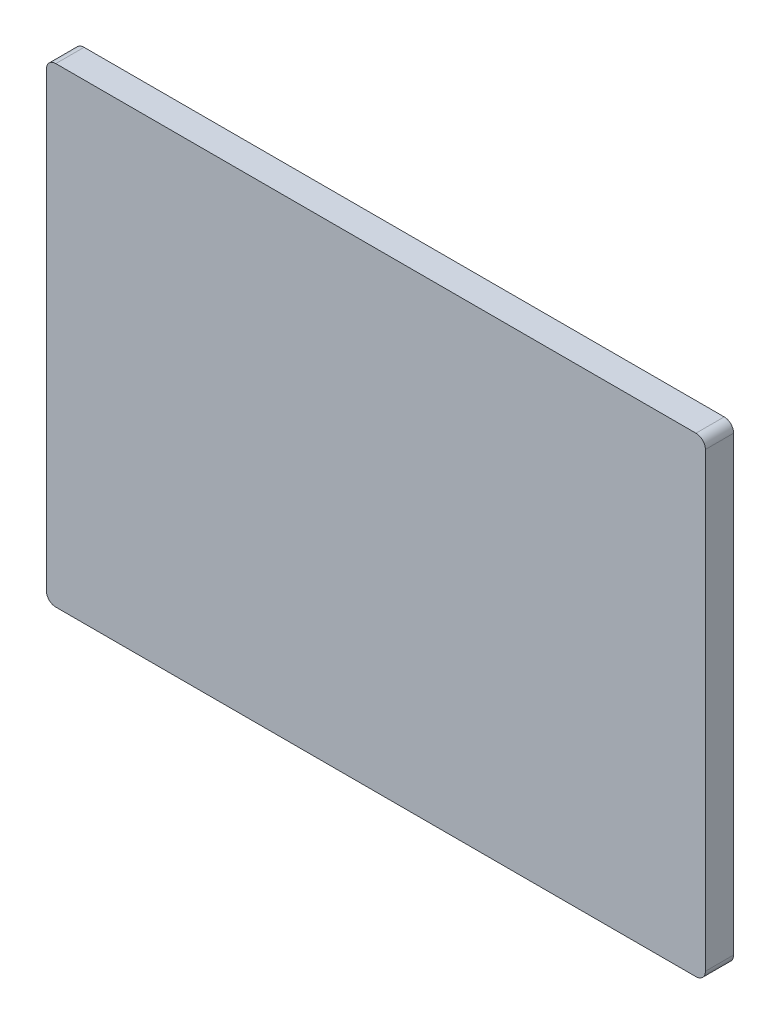
ISO-10303-21;
HEADER;
FILE_DESCRIPTION(('STEP AP214'),'2;1');
FILE_NAME('part.step','',(''),(''),'','','');
FILE_SCHEMA(('AUTOMOTIVE_DESIGN { 1 0 10303 214 1 1 1 1 }'));
ENDSEC;
DATA;
#1=APPLICATION_CONTEXT('core data for automotive mechanical design processes');
#2=APPLICATION_PROTOCOL_DEFINITION('international standard','automotive_design',2000,#1);
#3=PRODUCT_CONTEXT('',#1,'mechanical');
#4=PRODUCT('Part','Part','',(#3));
#5=PRODUCT_RELATED_PRODUCT_CATEGORY('part','',(#4));
#6=PRODUCT_DEFINITION_FORMATION('','',#4);
#7=PRODUCT_DEFINITION_CONTEXT('part definition',#1,'design');
#8=PRODUCT_DEFINITION('design','',#6,#7);
#9=PRODUCT_DEFINITION_SHAPE('','',#8);
#10=(LENGTH_UNIT() NAMED_UNIT(*) SI_UNIT(.MILLI.,.METRE.));
#11=(NAMED_UNIT(*) PLANE_ANGLE_UNIT() SI_UNIT($,.RADIAN.));
#12=(NAMED_UNIT(*) SI_UNIT($,.STERADIAN.) SOLID_ANGLE_UNIT());
#13=UNCERTAINTY_MEASURE_WITH_UNIT(LENGTH_MEASURE(1.E-05),#10,'distance_accuracy_value','');
#14=(GEOMETRIC_REPRESENTATION_CONTEXT(3) GLOBAL_UNCERTAINTY_ASSIGNED_CONTEXT((#13)) GLOBAL_UNIT_ASSIGNED_CONTEXT((#10,
#11,#12)) REPRESENTATION_CONTEXT('',''));
#15=CARTESIAN_POINT('',(0.,0.,0.));
#16=DIRECTION('',(0.,0.,1.));
#17=DIRECTION('',(1.,0.,0.));
#18=AXIS2_PLACEMENT_3D('',#15,#16,#17);
#19=CARTESIAN_POINT('',(-175.,-125.,15.));
#20=DIRECTION('',(1.,0.,0.));
#21=DIRECTION('',(0.,0.,-1.));
#22=AXIS2_PLACEMENT_3D('',#19,#20,#21);
#23=PLANE('',#22);
#24=DIRECTION('',(0.,-1.,0.));
#25=VECTOR('',#24,1.);
#26=CARTESIAN_POINT('',(-175.,-125.,0.));
#27=LINE('',#26,#25);
#28=CARTESIAN_POINT('',(-175.,120.,0.));
#29=VERTEX_POINT('',#28);
#30=CARTESIAN_POINT('',(-175.,-120.,0.));
#31=VERTEX_POINT('',#30);
#32=EDGE_CURVE('E127',#29,#31,#27,.T.);
#33=ORIENTED_EDGE('',*,*,#32,.T.);
#34=DIRECTION('',(0.,0.,-1.));
#35=VECTOR('',#34,1.);
#36=CARTESIAN_POINT('',(-175.,-120.,15.));
#37=LINE('',#36,#35);
#38=CARTESIAN_POINT('',(-175.,-120.,15.));
#39=VERTEX_POINT('',#38);
#40=EDGE_CURVE('E150',#31,#39,#37,.F.);
#41=ORIENTED_EDGE('',*,*,#40,.T.);
#42=DIRECTION('',(0.,-1.,0.));
#43=VECTOR('',#42,1.);
#44=CARTESIAN_POINT('',(-175.,-125.,15.));
#45=LINE('',#44,#43);
#46=CARTESIAN_POINT('',(-175.,120.,15.));
#47=VERTEX_POINT('',#46);
#48=EDGE_CURVE('E125',#47,#39,#45,.T.);
#49=ORIENTED_EDGE('',*,*,#48,.F.);
#50=DIRECTION('',(0.,0.,-1.));
#51=VECTOR('',#50,1.);
#52=CARTESIAN_POINT('',(-175.,120.,15.));
#53=LINE('',#52,#51);
#54=EDGE_CURVE('E147',#47,#29,#53,.T.);
#55=ORIENTED_EDGE('',*,*,#54,.T.);
#56=EDGE_LOOP('',(#33,#41,#49,#55));
#57=FACE_BOUND('',#56,.T.);
#58=ADVANCED_FACE('F32',(#57),#23,.F.);
#59=CARTESIAN_POINT('',(175.,-125.,15.));
#60=DIRECTION('',(0.,1.,0.));
#61=DIRECTION('',(-1.,0.,0.));
#62=AXIS2_PLACEMENT_3D('',#59,#60,#61);
#63=PLANE('',#62);
#64=DIRECTION('',(1.,0.,0.));
#65=VECTOR('',#64,1.);
#66=CARTESIAN_POINT('',(175.,-125.,0.));
#67=LINE('',#66,#65);
#68=CARTESIAN_POINT('',(-170.,-125.,0.));
#69=VERTEX_POINT('',#68);
#70=CARTESIAN_POINT('',(170.,-125.,0.));
#71=VERTEX_POINT('',#70);
#72=EDGE_CURVE('E123',#69,#71,#67,.T.);
#73=ORIENTED_EDGE('',*,*,#72,.T.);
#74=DIRECTION('',(0.,0.,-1.));
#75=VECTOR('',#74,1.);
#76=CARTESIAN_POINT('',(170.,-125.,15.));
#77=LINE('',#76,#75);
#78=CARTESIAN_POINT('',(170.,-125.,15.));
#79=VERTEX_POINT('',#78);
#80=EDGE_CURVE('E102',#71,#79,#77,.F.);
#81=ORIENTED_EDGE('',*,*,#80,.T.);
#82=DIRECTION('',(1.,0.,0.));
#83=VECTOR('',#82,1.);
#84=CARTESIAN_POINT('',(175.,-125.,15.));
#85=LINE('',#84,#83);
#86=CARTESIAN_POINT('',(-170.,-125.,15.));
#87=VERTEX_POINT('',#86);
#88=EDGE_CURVE('E166',#87,#79,#85,.T.);
#89=ORIENTED_EDGE('',*,*,#88,.F.);
#90=DIRECTION('',(0.,0.,-1.));
#91=VECTOR('',#90,1.);
#92=CARTESIAN_POINT('',(-170.,-125.,15.));
#93=LINE('',#92,#91);
#94=EDGE_CURVE('E107',#87,#69,#93,.T.);
#95=ORIENTED_EDGE('',*,*,#94,.T.);
#96=EDGE_LOOP('',(#73,#81,#89,#95));
#97=FACE_BOUND('',#96,.T.);
#98=ADVANCED_FACE('F183',(#97),#63,.F.);
#99=CARTESIAN_POINT('',(175.,-125.,15.));
#100=DIRECTION('',(-1.,0.,0.));
#101=DIRECTION('',(0.,0.,1.));
#102=AXIS2_PLACEMENT_3D('',#99,#100,#101);
#103=PLANE('',#102);
#104=DIRECTION('',(0.,1.,0.));
#105=VECTOR('',#104,1.);
#106=CARTESIAN_POINT('',(175.,-125.,15.));
#107=LINE('',#106,#105);
#108=CARTESIAN_POINT('',(175.,-120.,15.));
#109=VERTEX_POINT('',#108);
#110=CARTESIAN_POINT('',(175.,120.,15.));
#111=VERTEX_POINT('',#110);
#112=EDGE_CURVE('E116',#109,#111,#107,.T.);
#113=ORIENTED_EDGE('',*,*,#112,.F.);
#114=DIRECTION('',(0.,0.,-1.));
#115=VECTOR('',#114,1.);
#116=CARTESIAN_POINT('',(175.,-120.,15.));
#117=LINE('',#116,#115);
#118=CARTESIAN_POINT('',(175.,-120.,0.));
#119=VERTEX_POINT('',#118);
#120=EDGE_CURVE('E101',#109,#119,#117,.T.);
#121=ORIENTED_EDGE('',*,*,#120,.T.);
#122=DIRECTION('',(0.,1.,0.));
#123=VECTOR('',#122,1.);
#124=CARTESIAN_POINT('',(175.,-125.,0.));
#125=LINE('',#124,#123);
#126=CARTESIAN_POINT('',(175.,120.,0.));
#127=VERTEX_POINT('',#126);
#128=EDGE_CURVE('E114',#119,#127,#125,.T.);
#129=ORIENTED_EDGE('',*,*,#128,.T.);
#130=DIRECTION('',(0.,0.,-1.));
#131=VECTOR('',#130,1.);
#132=CARTESIAN_POINT('',(175.,120.,15.));
#133=LINE('',#132,#131);
#134=EDGE_CURVE('E118',#127,#111,#133,.F.);
#135=ORIENTED_EDGE('',*,*,#134,.T.);
#136=EDGE_LOOP('',(#113,#121,#129,#135));
#137=FACE_BOUND('',#136,.T.);
#138=ADVANCED_FACE('F113',(#137),#103,.F.);
#139=CARTESIAN_POINT('',(175.,125.,15.));
#140=DIRECTION('',(0.,-1.,0.));
#141=DIRECTION('',(1.,0.,0.));
#142=AXIS2_PLACEMENT_3D('',#139,#140,#141);
#143=PLANE('',#142);
#144=DIRECTION('',(-1.,0.,0.));
#145=VECTOR('',#144,1.);
#146=CARTESIAN_POINT('',(175.,125.,0.));
#147=LINE('',#146,#145);
#148=CARTESIAN_POINT('',(170.,125.,0.));
#149=VERTEX_POINT('',#148);
#150=CARTESIAN_POINT('',(-170.,125.,0.));
#151=VERTEX_POINT('',#150);
#152=EDGE_CURVE('E122',#149,#151,#147,.T.);
#153=ORIENTED_EDGE('',*,*,#152,.T.);
#154=DIRECTION('',(0.,0.,-1.));
#155=VECTOR('',#154,1.);
#156=CARTESIAN_POINT('',(-170.,125.,15.));
#157=LINE('',#156,#155);
#158=CARTESIAN_POINT('',(-170.,125.,15.));
#159=VERTEX_POINT('',#158);
#160=EDGE_CURVE('E11',#151,#159,#157,.F.);
#161=ORIENTED_EDGE('',*,*,#160,.T.);
#162=DIRECTION('',(-1.,0.,0.));
#163=VECTOR('',#162,1.);
#164=CARTESIAN_POINT('',(175.,125.,15.));
#165=LINE('',#164,#163);
#166=CARTESIAN_POINT('',(170.,125.,15.));
#167=VERTEX_POINT('',#166);
#168=EDGE_CURVE('E131',#167,#159,#165,.T.);
#169=ORIENTED_EDGE('',*,*,#168,.F.);
#170=DIRECTION('',(0.,0.,-1.));
#171=VECTOR('',#170,1.);
#172=CARTESIAN_POINT('',(170.,125.,15.));
#173=LINE('',#172,#171);
#174=EDGE_CURVE('E40',#167,#149,#173,.T.);
#175=ORIENTED_EDGE('',*,*,#174,.T.);
#176=EDGE_LOOP('',(#153,#161,#169,#175));
#177=FACE_BOUND('',#176,.T.);
#178=ADVANCED_FACE('F153',(#177),#143,.F.);
#179=CARTESIAN_POINT('',(0.,0.,15.));
#180=DIRECTION('',(0.,0.,1.));
#181=DIRECTION('',(1.,0.,0.));
#182=AXIS2_PLACEMENT_3D('',#179,#180,#181);
#183=PLANE('',#182);
#184=ORIENTED_EDGE('',*,*,#88,.T.);
#185=CARTESIAN_POINT('',(170.,-120.,15.));
#186=DIRECTION('',(0.,0.,1.));
#187=DIRECTION('',(1.,0.,0.));
#188=AXIS2_PLACEMENT_3D('',#185,#186,#187);
#189=CIRCLE('',#188,5.);
#190=EDGE_CURVE('E145',#79,#109,#189,.T.);
#191=ORIENTED_EDGE('',*,*,#190,.T.);
#192=ORIENTED_EDGE('',*,*,#112,.T.);
#193=CARTESIAN_POINT('',(170.,120.,15.));
#194=DIRECTION('',(0.,0.,1.));
#195=DIRECTION('',(1.,0.,0.));
#196=AXIS2_PLACEMENT_3D('',#193,#194,#195);
#197=CIRCLE('',#196,5.);
#198=EDGE_CURVE('E52',#111,#167,#197,.T.);
#199=ORIENTED_EDGE('',*,*,#198,.T.);
#200=ORIENTED_EDGE('',*,*,#168,.T.);
#201=CARTESIAN_POINT('',(-170.,120.,15.));
#202=DIRECTION('',(0.,0.,1.));
#203=DIRECTION('',(1.,0.,0.));
#204=AXIS2_PLACEMENT_3D('',#201,#202,#203);
#205=CIRCLE('',#204,5.);
#206=EDGE_CURVE('E141',#159,#47,#205,.T.);
#207=ORIENTED_EDGE('',*,*,#206,.T.);
#208=ORIENTED_EDGE('',*,*,#48,.T.);
#209=CARTESIAN_POINT('',(-170.,-120.,15.));
#210=DIRECTION('',(0.,0.,1.));
#211=DIRECTION('',(1.,0.,0.));
#212=AXIS2_PLACEMENT_3D('',#209,#210,#211);
#213=CIRCLE('',#212,5.);
#214=EDGE_CURVE('E143',#39,#87,#213,.T.);
#215=ORIENTED_EDGE('',*,*,#214,.T.);
#216=EDGE_LOOP('',(#184,#191,#192,#199,#200,#207,#208,#215));
#217=FACE_BOUND('',#216,.T.);
#218=ADVANCED_FACE('F172',(#217),#183,.T.);
#219=CARTESIAN_POINT('',(0.,0.,0.));
#220=DIRECTION('',(0.,0.,1.));
#221=DIRECTION('',(1.,0.,0.));
#222=AXIS2_PLACEMENT_3D('',#219,#220,#221);
#223=PLANE('',#222);
#224=ORIENTED_EDGE('',*,*,#128,.F.);
#225=CARTESIAN_POINT('',(170.,-120.,0.));
#226=DIRECTION('',(0.,0.,1.));
#227=DIRECTION('',(1.,0.,0.));
#228=AXIS2_PLACEMENT_3D('',#225,#226,#227);
#229=CIRCLE('',#228,5.);
#230=EDGE_CURVE('E97',#119,#71,#229,.F.);
#231=ORIENTED_EDGE('',*,*,#230,.T.);
#232=ORIENTED_EDGE('',*,*,#72,.F.);
#233=CARTESIAN_POINT('',(-170.,-120.,0.));
#234=DIRECTION('',(0.,0.,1.));
#235=DIRECTION('',(1.,0.,0.));
#236=AXIS2_PLACEMENT_3D('',#233,#234,#235);
#237=CIRCLE('',#236,5.);
#238=EDGE_CURVE('E108',#69,#31,#237,.F.);
#239=ORIENTED_EDGE('',*,*,#238,.T.);
#240=ORIENTED_EDGE('',*,*,#32,.F.);
#241=CARTESIAN_POINT('',(-170.,120.,0.));
#242=DIRECTION('',(0.,0.,1.));
#243=DIRECTION('',(1.,0.,0.));
#244=AXIS2_PLACEMENT_3D('',#241,#242,#243);
#245=CIRCLE('',#244,5.);
#246=EDGE_CURVE('E134',#29,#151,#245,.F.);
#247=ORIENTED_EDGE('',*,*,#246,.T.);
#248=ORIENTED_EDGE('',*,*,#152,.F.);
#249=CARTESIAN_POINT('',(170.,120.,0.));
#250=DIRECTION('',(0.,0.,1.));
#251=DIRECTION('',(1.,0.,0.));
#252=AXIS2_PLACEMENT_3D('',#249,#250,#251);
#253=CIRCLE('',#252,5.);
#254=EDGE_CURVE('E117',#149,#127,#253,.F.);
#255=ORIENTED_EDGE('',*,*,#254,.T.);
#256=EDGE_LOOP('',(#224,#231,#232,#239,#240,#247,#248,#255));
#257=FACE_BOUND('',#256,.T.);
#258=ADVANCED_FACE('F120',(#257),#223,.F.);
#259=CARTESIAN_POINT('',(170.,-120.,15.));
#260=DIRECTION('',(0.,0.,-1.));
#261=DIRECTION('',(-1.,0.,0.));
#262=AXIS2_PLACEMENT_3D('',#259,#260,#261);
#263=CYLINDRICAL_SURFACE('',#262,5.);
#264=ORIENTED_EDGE('',*,*,#190,.F.);
#265=ORIENTED_EDGE('',*,*,#80,.F.);
#266=ORIENTED_EDGE('',*,*,#230,.F.);
#267=ORIENTED_EDGE('',*,*,#120,.F.);
#268=EDGE_LOOP('',(#264,#265,#266,#267));
#269=FACE_BOUND('',#268,.T.);
#270=ADVANCED_FACE('F100',(#269),#263,.T.);
#271=CARTESIAN_POINT('',(-170.,-120.,15.));
#272=DIRECTION('',(0.,0.,-1.));
#273=DIRECTION('',(-1.,0.,0.));
#274=AXIS2_PLACEMENT_3D('',#271,#272,#273);
#275=CYLINDRICAL_SURFACE('',#274,5.);
#276=ORIENTED_EDGE('',*,*,#214,.F.);
#277=ORIENTED_EDGE('',*,*,#40,.F.);
#278=ORIENTED_EDGE('',*,*,#238,.F.);
#279=ORIENTED_EDGE('',*,*,#94,.F.);
#280=EDGE_LOOP('',(#276,#277,#278,#279));
#281=FACE_BOUND('',#280,.T.);
#282=ADVANCED_FACE('F194',(#281),#275,.T.);
#283=CARTESIAN_POINT('',(-170.,120.,15.));
#284=DIRECTION('',(0.,0.,-1.));
#285=DIRECTION('',(-1.,0.,0.));
#286=AXIS2_PLACEMENT_3D('',#283,#284,#285);
#287=CYLINDRICAL_SURFACE('',#286,5.);
#288=ORIENTED_EDGE('',*,*,#206,.F.);
#289=ORIENTED_EDGE('',*,*,#160,.F.);
#290=ORIENTED_EDGE('',*,*,#246,.F.);
#291=ORIENTED_EDGE('',*,*,#54,.F.);
#292=EDGE_LOOP('',(#288,#289,#290,#291));
#293=FACE_BOUND('',#292,.T.);
#294=ADVANCED_FACE('F160',(#293),#287,.T.);
#295=CARTESIAN_POINT('',(170.,120.,15.));
#296=DIRECTION('',(0.,0.,-1.));
#297=DIRECTION('',(-1.,0.,0.));
#298=AXIS2_PLACEMENT_3D('',#295,#296,#297);
#299=CYLINDRICAL_SURFACE('',#298,5.);
#300=ORIENTED_EDGE('',*,*,#198,.F.);
#301=ORIENTED_EDGE('',*,*,#134,.F.);
#302=ORIENTED_EDGE('',*,*,#254,.F.);
#303=ORIENTED_EDGE('',*,*,#174,.F.);
#304=EDGE_LOOP('',(#300,#301,#302,#303));
#305=FACE_BOUND('',#304,.T.);
#306=ADVANCED_FACE('F34',(#305),#299,.T.);
#307=CLOSED_SHELL('',(#58,#98,#138,#178,#218,#258,#270,#282,#294,#306));
#308=MANIFOLD_SOLID_BREP('B2',#307);
#309=ADVANCED_BREP_SHAPE_REPRESENTATION('',(#18,#308),#14);
#310=SHAPE_DEFINITION_REPRESENTATION(#9,#309);
ENDSEC;
END-ISO-10303-21;
